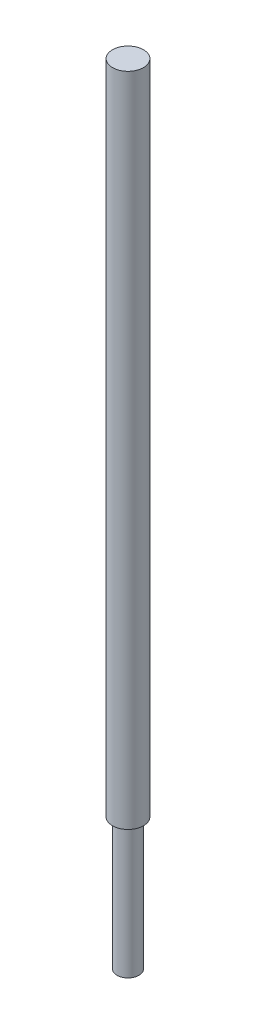
ISO-10303-21;
HEADER;
FILE_DESCRIPTION(('STEP AP214'),'2;1');
FILE_NAME('part.step','',(''),(''),'','','');
FILE_SCHEMA(('AUTOMOTIVE_DESIGN { 1 0 10303 214 1 1 1 1 }'));
ENDSEC;
DATA;
#1=APPLICATION_CONTEXT('core data for automotive mechanical design processes');
#2=APPLICATION_PROTOCOL_DEFINITION('international standard','automotive_design',2000,#1);
#3=PRODUCT_CONTEXT('',#1,'mechanical');
#4=PRODUCT('Part','Part','',(#3));
#5=PRODUCT_RELATED_PRODUCT_CATEGORY('part','',(#4));
#6=PRODUCT_DEFINITION_FORMATION('','',#4);
#7=PRODUCT_DEFINITION_CONTEXT('part definition',#1,'design');
#8=PRODUCT_DEFINITION('design','',#6,#7);
#9=PRODUCT_DEFINITION_SHAPE('','',#8);
#10=(LENGTH_UNIT() NAMED_UNIT(*) SI_UNIT(.MILLI.,.METRE.));
#11=(NAMED_UNIT(*) PLANE_ANGLE_UNIT() SI_UNIT($,.RADIAN.));
#12=(NAMED_UNIT(*) SI_UNIT($,.STERADIAN.) SOLID_ANGLE_UNIT());
#13=UNCERTAINTY_MEASURE_WITH_UNIT(LENGTH_MEASURE(1.E-05),#10,'distance_accuracy_value','');
#14=(GEOMETRIC_REPRESENTATION_CONTEXT(3) GLOBAL_UNCERTAINTY_ASSIGNED_CONTEXT((#13)) GLOBAL_UNIT_ASSIGNED_CONTEXT((#10,
#11,#12)) REPRESENTATION_CONTEXT('',''));
#15=CARTESIAN_POINT('',(0.,0.,0.));
#16=DIRECTION('',(0.,0.,1.));
#17=DIRECTION('',(1.,0.,0.));
#18=AXIS2_PLACEMENT_3D('',#15,#16,#17);
#19=CARTESIAN_POINT('',(0.,-27.,0.));
#20=DIRECTION('',(0.,-1.,0.));
#21=DIRECTION('',(0.,0.,-1.));
#22=AXIS2_PLACEMENT_3D('',#19,#20,#21);
#23=PLANE('',#22);
#24=CARTESIAN_POINT('',(0.,-27.,0.));
#25=DIRECTION('',(0.,-1.,0.));
#26=DIRECTION('',(0.,0.,-1.));
#27=AXIS2_PLACEMENT_3D('',#24,#25,#26);
#28=CIRCLE('',#27,2.25);
#29=CARTESIAN_POINT('',(0.,-27.,-2.25));
#30=VERTEX_POINT('',#29);
#31=EDGE_CURVE('E18',#30,#30,#28,.F.);
#32=ORIENTED_EDGE('',*,*,#31,.F.);
#33=EDGE_LOOP('',(#32));
#34=FACE_BOUND('',#33,.T.);
#35=ADVANCED_FACE('F15',(#34),#23,.T.);
#36=CARTESIAN_POINT('',(0.,0.,0.));
#37=DIRECTION('',(0.,-1.,0.));
#38=DIRECTION('',(0.,0.,-1.));
#39=AXIS2_PLACEMENT_3D('',#36,#37,#38);
#40=CYLINDRICAL_SURFACE('',#39,2.25);
#41=ORIENTED_EDGE('',*,*,#31,.T.);
#42=EDGE_LOOP('',(#41));
#43=FACE_BOUND('',#42,.T.);
#44=CARTESIAN_POINT('',(0.,0.,0.));
#45=DIRECTION('',(0.,-1.,0.));
#46=DIRECTION('',(0.,0.,-1.));
#47=AXIS2_PLACEMENT_3D('',#44,#45,#46);
#48=CIRCLE('',#47,2.25);
#49=CARTESIAN_POINT('',(0.,0.,-2.25));
#50=VERTEX_POINT('',#49);
#51=EDGE_CURVE('E27',#50,#50,#48,.T.);
#52=ORIENTED_EDGE('',*,*,#51,.T.);
#53=EDGE_LOOP('',(#52));
#54=FACE_BOUND('',#53,.T.);
#55=ADVANCED_FACE('F35',(#43,#54),#40,.T.);
#56=CARTESIAN_POINT('',(0.,134.5,0.));
#57=DIRECTION('',(0.,1.,0.));
#58=DIRECTION('',(0.,0.,1.));
#59=AXIS2_PLACEMENT_3D('',#56,#57,#58);
#60=PLANE('',#59);
#61=CARTESIAN_POINT('',(0.,134.5,0.));
#62=DIRECTION('',(0.,1.,0.));
#63=DIRECTION('',(0.,0.,1.));
#64=AXIS2_PLACEMENT_3D('',#61,#62,#63);
#65=CIRCLE('',#64,3.175);
#66=CARTESIAN_POINT('',(0.,134.5,3.175));
#67=VERTEX_POINT('',#66);
#68=EDGE_CURVE('E22',#67,#67,#65,.F.);
#69=ORIENTED_EDGE('',*,*,#68,.F.);
#70=EDGE_LOOP('',(#69));
#71=FACE_BOUND('',#70,.T.);
#72=ADVANCED_FACE('F42',(#71),#60,.T.);
#73=CARTESIAN_POINT('',(0.,0.,0.));
#74=DIRECTION('',(0.,1.,0.));
#75=DIRECTION('',(0.,0.,1.));
#76=AXIS2_PLACEMENT_3D('',#73,#74,#75);
#77=PLANE('',#76);
#78=ORIENTED_EDGE('',*,*,#51,.F.);
#79=EDGE_LOOP('',(#78));
#80=FACE_BOUND('',#79,.T.);
#81=CARTESIAN_POINT('',(0.,0.,0.));
#82=DIRECTION('',(0.,1.,0.));
#83=DIRECTION('',(0.,0.,1.));
#84=AXIS2_PLACEMENT_3D('',#81,#82,#83);
#85=CIRCLE('',#84,3.175);
#86=CARTESIAN_POINT('',(0.,0.,3.175));
#87=VERTEX_POINT('',#86);
#88=EDGE_CURVE('E10',#87,#87,#85,.T.);
#89=ORIENTED_EDGE('',*,*,#88,.F.);
#90=EDGE_LOOP('',(#89));
#91=FACE_BOUND('',#90,.T.);
#92=ADVANCED_FACE('F45',(#80,#91),#77,.F.);
#93=CARTESIAN_POINT('',(0.,0.,0.));
#94=DIRECTION('',(0.,1.,0.));
#95=DIRECTION('',(0.,0.,1.));
#96=AXIS2_PLACEMENT_3D('',#93,#94,#95);
#97=CYLINDRICAL_SURFACE('',#96,3.175);
#98=ORIENTED_EDGE('',*,*,#68,.T.);
#99=EDGE_LOOP('',(#98));
#100=FACE_BOUND('',#99,.T.);
#101=ORIENTED_EDGE('',*,*,#88,.T.);
#102=EDGE_LOOP('',(#101));
#103=FACE_BOUND('',#102,.T.);
#104=ADVANCED_FACE('F43',(#100,#103),#97,.T.);
#105=CLOSED_SHELL('',(#35,#55,#72,#92,#104));
#106=MANIFOLD_SOLID_BREP('B1',#105);
#107=ADVANCED_BREP_SHAPE_REPRESENTATION('',(#18,#106),#14);
#108=SHAPE_DEFINITION_REPRESENTATION(#9,#107);
ENDSEC;
END-ISO-10303-21;
